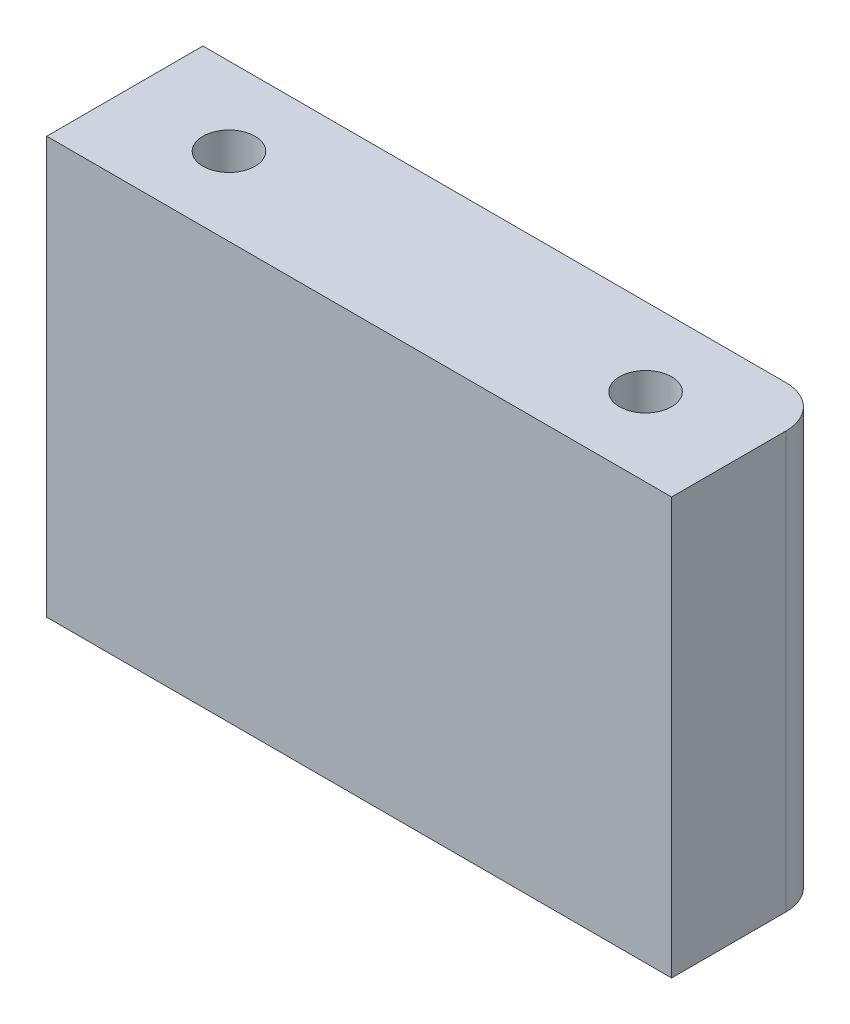
ISO-10303-21;
HEADER;
FILE_DESCRIPTION(('STEP AP214'),'2;1');
FILE_NAME('part.step','',(''),(''),'','','');
FILE_SCHEMA(('AUTOMOTIVE_DESIGN { 1 0 10303 214 1 1 1 1 }'));
ENDSEC;
DATA;
#1=APPLICATION_CONTEXT('core data for automotive mechanical design processes');
#2=APPLICATION_PROTOCOL_DEFINITION('international standard','automotive_design',2000,#1);
#3=PRODUCT_CONTEXT('',#1,'mechanical');
#4=PRODUCT('Part','Part','',(#3));
#5=PRODUCT_RELATED_PRODUCT_CATEGORY('part','',(#4));
#6=PRODUCT_DEFINITION_FORMATION('','',#4);
#7=PRODUCT_DEFINITION_CONTEXT('part definition',#1,'design');
#8=PRODUCT_DEFINITION('design','',#6,#7);
#9=PRODUCT_DEFINITION_SHAPE('','',#8);
#10=(LENGTH_UNIT() NAMED_UNIT(*) SI_UNIT(.MILLI.,.METRE.));
#11=(NAMED_UNIT(*) PLANE_ANGLE_UNIT() SI_UNIT($,.RADIAN.));
#12=(NAMED_UNIT(*) SI_UNIT($,.STERADIAN.) SOLID_ANGLE_UNIT());
#13=UNCERTAINTY_MEASURE_WITH_UNIT(LENGTH_MEASURE(1.E-05),#10,'distance_accuracy_value','');
#14=(GEOMETRIC_REPRESENTATION_CONTEXT(3) GLOBAL_UNCERTAINTY_ASSIGNED_CONTEXT((#13)) GLOBAL_UNIT_ASSIGNED_CONTEXT((#10,
#11,#12)) REPRESENTATION_CONTEXT('',''));
#15=CARTESIAN_POINT('',(0.,0.,0.));
#16=DIRECTION('',(0.,0.,1.));
#17=DIRECTION('',(1.,0.,0.));
#18=AXIS2_PLACEMENT_3D('',#15,#16,#17);
#19=CARTESIAN_POINT('',(0.,0.,9.525));
#20=DIRECTION('',(1.,0.,0.));
#21=DIRECTION('',(0.,0.,-1.));
#22=AXIS2_PLACEMENT_3D('',#19,#20,#21);
#23=PLANE('',#22);
#24=DIRECTION('',(0.,-1.,0.));
#25=VECTOR('',#24,1.);
#26=CARTESIAN_POINT('',(0.,0.,0.));
#27=LINE('',#26,#25);
#28=CARTESIAN_POINT('',(0.,25.4,0.));
#29=VERTEX_POINT('',#28);
#30=CARTESIAN_POINT('',(0.,0.,0.));
#31=VERTEX_POINT('',#30);
#32=EDGE_CURVE('E112',#29,#31,#27,.T.);
#33=ORIENTED_EDGE('',*,*,#32,.T.);
#34=DIRECTION('',(0.,0.,-1.));
#35=VECTOR('',#34,1.);
#36=CARTESIAN_POINT('',(0.,0.,9.525));
#37=LINE('',#36,#35);
#38=CARTESIAN_POINT('',(0.,0.,9.525));
#39=VERTEX_POINT('',#38);
#40=EDGE_CURVE('E93',#39,#31,#37,.T.);
#41=ORIENTED_EDGE('',*,*,#40,.F.);
#42=DIRECTION('',(0.,-1.,0.));
#43=VECTOR('',#42,1.);
#44=CARTESIAN_POINT('',(0.,0.,9.525));
#45=LINE('',#44,#43);
#46=CARTESIAN_POINT('',(0.,25.4,9.525));
#47=VERTEX_POINT('',#46);
#48=EDGE_CURVE('E100',#47,#39,#45,.T.);
#49=ORIENTED_EDGE('',*,*,#48,.F.);
#50=DIRECTION('',(0.,0.,-1.));
#51=VECTOR('',#50,1.);
#52=CARTESIAN_POINT('',(0.,25.4,9.525));
#53=LINE('',#52,#51);
#54=EDGE_CURVE('E122',#47,#29,#53,.T.);
#55=ORIENTED_EDGE('',*,*,#54,.T.);
#56=EDGE_LOOP('',(#33,#41,#49,#55));
#57=FACE_BOUND('',#56,.T.);
#58=ADVANCED_FACE('F44',(#57),#23,.F.);
#59=CARTESIAN_POINT('',(0.,0.,9.525));
#60=DIRECTION('',(0.,1.,0.));
#61=DIRECTION('',(0.,0.,1.));
#62=AXIS2_PLACEMENT_3D('',#59,#60,#61);
#63=PLANE('',#62);
#64=CARTESIAN_POINT('',(31.75,0.,4.7625));
#65=DIRECTION('',(0.,-1.,0.));
#66=DIRECTION('',(0.,0.,1.));
#67=AXIS2_PLACEMENT_3D('',#64,#65,#66);
#68=CIRCLE('',#67,1.5875);
#69=CARTESIAN_POINT('',(31.75,0.,6.35));
#70=VERTEX_POINT('',#69);
#71=EDGE_CURVE('E137',#70,#70,#68,.T.);
#72=ORIENTED_EDGE('',*,*,#71,.F.);
#73=EDGE_LOOP('',(#72));
#74=FACE_BOUND('',#73,.T.);
#75=CARTESIAN_POINT('',(6.35,0.,4.7625));
#76=DIRECTION('',(0.,-1.,0.));
#77=DIRECTION('',(0.,0.,-1.));
#78=AXIS2_PLACEMENT_3D('',#75,#76,#77);
#79=CIRCLE('',#78,1.5875);
#80=CARTESIAN_POINT('',(6.35,0.,3.175));
#81=VERTEX_POINT('',#80);
#82=EDGE_CURVE('E131',#81,#81,#79,.T.);
#83=ORIENTED_EDGE('',*,*,#82,.F.);
#84=EDGE_LOOP('',(#83));
#85=FACE_BOUND('',#84,.T.);
#86=DIRECTION('',(1.,0.,0.));
#87=VECTOR('',#86,1.);
#88=CARTESIAN_POINT('',(0.,0.,0.));
#89=LINE('',#88,#87);
#90=CARTESIAN_POINT('',(35.56,0.,0.));
#91=VERTEX_POINT('',#90);
#92=EDGE_CURVE('E125',#31,#91,#89,.T.);
#93=ORIENTED_EDGE('',*,*,#92,.T.);
#94=CARTESIAN_POINT('',(35.56,0.,2.54));
#95=DIRECTION('',(0.,1.,0.));
#96=DIRECTION('',(0.,0.,1.));
#97=AXIS2_PLACEMENT_3D('',#94,#95,#96);
#98=CIRCLE('',#97,2.54);
#99=CARTESIAN_POINT('',(38.1,0.,2.54));
#100=VERTEX_POINT('',#99);
#101=EDGE_CURVE('E13',#91,#100,#98,.F.);
#102=ORIENTED_EDGE('',*,*,#101,.T.);
#103=DIRECTION('',(0.,0.,-1.));
#104=VECTOR('',#103,1.);
#105=CARTESIAN_POINT('',(38.1,0.,9.525));
#106=LINE('',#105,#104);
#107=CARTESIAN_POINT('',(38.1,0.,9.525));
#108=VERTEX_POINT('',#107);
#109=EDGE_CURVE('E96',#108,#100,#106,.T.);
#110=ORIENTED_EDGE('',*,*,#109,.F.);
#111=DIRECTION('',(1.,0.,0.));
#112=VECTOR('',#111,1.);
#113=CARTESIAN_POINT('',(0.,0.,9.525));
#114=LINE('',#113,#112);
#115=EDGE_CURVE('E89',#39,#108,#114,.T.);
#116=ORIENTED_EDGE('',*,*,#115,.F.);
#117=ORIENTED_EDGE('',*,*,#40,.T.);
#118=EDGE_LOOP('',(#93,#102,#110,#116,#117));
#119=FACE_BOUND('',#118,.T.);
#120=ADVANCED_FACE('F91',(#74,#85,#119),#63,.F.);
#121=CARTESIAN_POINT('',(38.1,0.,9.525));
#122=DIRECTION('',(-1.,0.,0.));
#123=DIRECTION('',(0.,0.,1.));
#124=AXIS2_PLACEMENT_3D('',#121,#122,#123);
#125=PLANE('',#124);
#126=ORIENTED_EDGE('',*,*,#109,.T.);
#127=DIRECTION('',(0.,1.,0.));
#128=VECTOR('',#127,1.);
#129=CARTESIAN_POINT('',(38.1,25.4,2.54));
#130=LINE('',#129,#128);
#131=CARTESIAN_POINT('',(38.1,25.4,2.54));
#132=VERTEX_POINT('',#131);
#133=EDGE_CURVE('E113',#100,#132,#130,.T.);
#134=ORIENTED_EDGE('',*,*,#133,.T.);
#135=DIRECTION('',(0.,0.,-1.));
#136=VECTOR('',#135,1.);
#137=CARTESIAN_POINT('',(38.1,25.4,9.525));
#138=LINE('',#137,#136);
#139=CARTESIAN_POINT('',(38.1,25.4,9.525));
#140=VERTEX_POINT('',#139);
#141=EDGE_CURVE('E117',#140,#132,#138,.T.);
#142=ORIENTED_EDGE('',*,*,#141,.F.);
#143=DIRECTION('',(0.,1.,0.));
#144=VECTOR('',#143,1.);
#145=CARTESIAN_POINT('',(38.1,0.,9.525));
#146=LINE('',#145,#144);
#147=EDGE_CURVE('E99',#108,#140,#146,.T.);
#148=ORIENTED_EDGE('',*,*,#147,.F.);
#149=EDGE_LOOP('',(#126,#134,#142,#148));
#150=FACE_BOUND('',#149,.T.);
#151=ADVANCED_FACE('F155',(#150),#125,.F.);
#152=CARTESIAN_POINT('',(0.,25.4,9.525));
#153=DIRECTION('',(0.,-1.,0.));
#154=DIRECTION('',(0.,0.,-1.));
#155=AXIS2_PLACEMENT_3D('',#152,#153,#154);
#156=PLANE('',#155);
#157=CARTESIAN_POINT('',(31.75,25.4,4.7625));
#158=DIRECTION('',(0.,-1.,0.));
#159=DIRECTION('',(0.,0.,1.));
#160=AXIS2_PLACEMENT_3D('',#157,#158,#159);
#161=CIRCLE('',#160,1.5875);
#162=CARTESIAN_POINT('',(31.75,25.4,6.35));
#163=VERTEX_POINT('',#162);
#164=EDGE_CURVE('E134',#163,#163,#161,.T.);
#165=ORIENTED_EDGE('',*,*,#164,.T.);
#166=EDGE_LOOP('',(#165));
#167=FACE_BOUND('',#166,.T.);
#168=CARTESIAN_POINT('',(6.35,25.4,4.7625));
#169=DIRECTION('',(0.,-1.,0.));
#170=DIRECTION('',(0.,0.,-1.));
#171=AXIS2_PLACEMENT_3D('',#168,#169,#170);
#172=CIRCLE('',#171,1.5875);
#173=CARTESIAN_POINT('',(6.35,25.4,3.175));
#174=VERTEX_POINT('',#173);
#175=EDGE_CURVE('E128',#174,#174,#172,.T.);
#176=ORIENTED_EDGE('',*,*,#175,.T.);
#177=EDGE_LOOP('',(#176));
#178=FACE_BOUND('',#177,.T.);
#179=ORIENTED_EDGE('',*,*,#141,.T.);
#180=CARTESIAN_POINT('',(35.56,25.4,2.54));
#181=DIRECTION('',(0.,-1.,0.));
#182=DIRECTION('',(0.,0.,-1.));
#183=AXIS2_PLACEMENT_3D('',#180,#181,#182);
#184=CIRCLE('',#183,2.54);
#185=CARTESIAN_POINT('',(35.56,25.4,0.));
#186=VERTEX_POINT('',#185);
#187=EDGE_CURVE('E66',#132,#186,#184,.F.);
#188=ORIENTED_EDGE('',*,*,#187,.T.);
#189=DIRECTION('',(-1.,0.,0.));
#190=VECTOR('',#189,1.);
#191=CARTESIAN_POINT('',(0.,25.4,0.));
#192=LINE('',#191,#190);
#193=EDGE_CURVE('E109',#186,#29,#192,.T.);
#194=ORIENTED_EDGE('',*,*,#193,.T.);
#195=ORIENTED_EDGE('',*,*,#54,.F.);
#196=DIRECTION('',(-1.,0.,0.));
#197=VECTOR('',#196,1.);
#198=CARTESIAN_POINT('',(0.,25.4,9.525));
#199=LINE('',#198,#197);
#200=EDGE_CURVE('E105',#140,#47,#199,.T.);
#201=ORIENTED_EDGE('',*,*,#200,.F.);
#202=EDGE_LOOP('',(#179,#188,#194,#195,#201));
#203=FACE_BOUND('',#202,.T.);
#204=ADVANCED_FACE('F143',(#167,#178,#203),#156,.F.);
#205=CARTESIAN_POINT('',(0.,0.,9.525));
#206=DIRECTION('',(0.,0.,-1.));
#207=DIRECTION('',(-1.,0.,0.));
#208=AXIS2_PLACEMENT_3D('',#205,#206,#207);
#209=PLANE('',#208);
#210=ORIENTED_EDGE('',*,*,#48,.T.);
#211=ORIENTED_EDGE('',*,*,#115,.T.);
#212=ORIENTED_EDGE('',*,*,#147,.T.);
#213=ORIENTED_EDGE('',*,*,#200,.T.);
#214=EDGE_LOOP('',(#210,#211,#212,#213));
#215=FACE_BOUND('',#214,.T.);
#216=ADVANCED_FACE('F103',(#215),#209,.F.);
#217=CARTESIAN_POINT('',(0.,0.,0.));
#218=DIRECTION('',(0.,0.,-1.));
#219=DIRECTION('',(-1.,0.,0.));
#220=AXIS2_PLACEMENT_3D('',#217,#218,#219);
#221=PLANE('',#220);
#222=ORIENTED_EDGE('',*,*,#193,.F.);
#223=DIRECTION('',(0.,1.,0.));
#224=VECTOR('',#223,1.);
#225=CARTESIAN_POINT('',(35.56,0.,0.));
#226=LINE('',#225,#224);
#227=EDGE_CURVE('E52',#186,#91,#226,.F.);
#228=ORIENTED_EDGE('',*,*,#227,.T.);
#229=ORIENTED_EDGE('',*,*,#92,.F.);
#230=ORIENTED_EDGE('',*,*,#32,.F.);
#231=EDGE_LOOP('',(#222,#228,#229,#230));
#232=FACE_BOUND('',#231,.T.);
#233=ADVANCED_FACE('F160',(#232),#221,.T.);
#234=CARTESIAN_POINT('',(6.35,25.4,4.7625));
#235=DIRECTION('',(0.,-1.,0.));
#236=DIRECTION('',(0.,0.,-1.));
#237=AXIS2_PLACEMENT_3D('',#234,#235,#236);
#238=CYLINDRICAL_SURFACE('',#237,1.5875);
#239=ORIENTED_EDGE('',*,*,#175,.F.);
#240=EDGE_LOOP('',(#239));
#241=FACE_BOUND('',#240,.T.);
#242=ORIENTED_EDGE('',*,*,#82,.T.);
#243=EDGE_LOOP('',(#242));
#244=FACE_BOUND('',#243,.T.);
#245=ADVANCED_FACE('F149',(#241,#244),#238,.F.);
#246=CARTESIAN_POINT('',(31.75,25.4,4.7625));
#247=DIRECTION('',(0.,-1.,0.));
#248=DIRECTION('',(0.,0.,-1.));
#249=AXIS2_PLACEMENT_3D('',#246,#247,#248);
#250=CYLINDRICAL_SURFACE('',#249,1.5875);
#251=ORIENTED_EDGE('',*,*,#164,.F.);
#252=EDGE_LOOP('',(#251));
#253=FACE_BOUND('',#252,.T.);
#254=ORIENTED_EDGE('',*,*,#71,.T.);
#255=EDGE_LOOP('',(#254));
#256=FACE_BOUND('',#255,.T.);
#257=ADVANCED_FACE('F146',(#253,#256),#250,.F.);
#258=CARTESIAN_POINT('',(35.56,0.,2.54));
#259=DIRECTION('',(0.,-1.,0.));
#260=DIRECTION('',(0.,0.,-1.));
#261=AXIS2_PLACEMENT_3D('',#258,#259,#260);
#262=CYLINDRICAL_SURFACE('',#261,2.54);
#263=ORIENTED_EDGE('',*,*,#101,.F.);
#264=ORIENTED_EDGE('',*,*,#227,.F.);
#265=ORIENTED_EDGE('',*,*,#187,.F.);
#266=ORIENTED_EDGE('',*,*,#133,.F.);
#267=EDGE_LOOP('',(#263,#264,#265,#266));
#268=FACE_BOUND('',#267,.T.);
#269=ADVANCED_FACE('F46',(#268),#262,.T.);
#270=CLOSED_SHELL('',(#58,#120,#151,#204,#216,#233,#245,#257,#269));
#271=MANIFOLD_SOLID_BREP('B2',#270);
#272=ADVANCED_BREP_SHAPE_REPRESENTATION('',(#18,#271),#14);
#273=SHAPE_DEFINITION_REPRESENTATION(#9,#272);
ENDSEC;
END-ISO-10303-21;
